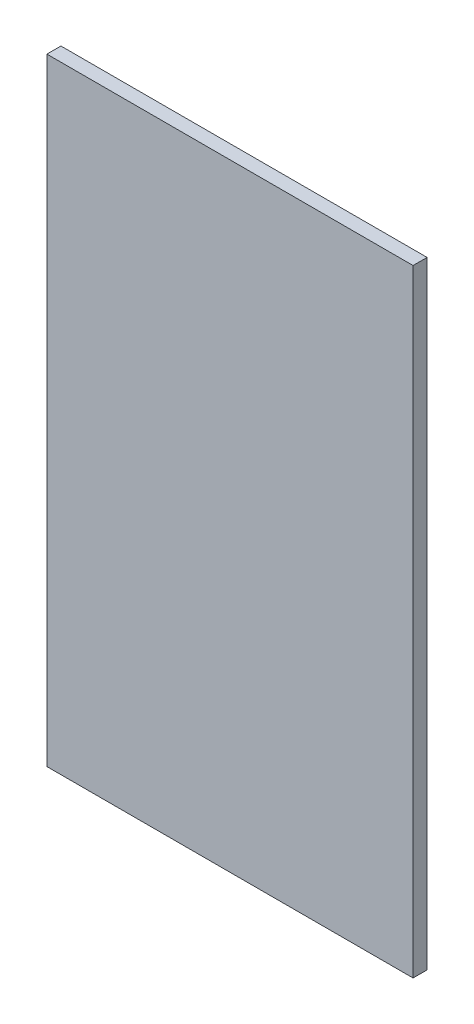
ISO-10303-21;
HEADER;
FILE_DESCRIPTION(('STEP AP214'),'2;1');
FILE_NAME('part.step','',(''),(''),'','','');
FILE_SCHEMA(('AUTOMOTIVE_DESIGN { 1 0 10303 214 1 1 1 1 }'));
ENDSEC;
DATA;
#1=APPLICATION_CONTEXT('core data for automotive mechanical design processes');
#2=APPLICATION_PROTOCOL_DEFINITION('international standard','automotive_design',2000,#1);
#3=PRODUCT_CONTEXT('',#1,'mechanical');
#4=PRODUCT('Part','Part','',(#3));
#5=PRODUCT_RELATED_PRODUCT_CATEGORY('part','',(#4));
#6=PRODUCT_DEFINITION_FORMATION('','',#4);
#7=PRODUCT_DEFINITION_CONTEXT('part definition',#1,'design');
#8=PRODUCT_DEFINITION('design','',#6,#7);
#9=PRODUCT_DEFINITION_SHAPE('','',#8);
#10=(LENGTH_UNIT() NAMED_UNIT(*) SI_UNIT(.MILLI.,.METRE.));
#11=(NAMED_UNIT(*) PLANE_ANGLE_UNIT() SI_UNIT($,.RADIAN.));
#12=(NAMED_UNIT(*) SI_UNIT($,.STERADIAN.) SOLID_ANGLE_UNIT());
#13=UNCERTAINTY_MEASURE_WITH_UNIT(LENGTH_MEASURE(1.E-05),#10,'distance_accuracy_value','');
#14=(GEOMETRIC_REPRESENTATION_CONTEXT(3) GLOBAL_UNCERTAINTY_ASSIGNED_CONTEXT((#13)) GLOBAL_UNIT_ASSIGNED_CONTEXT((#10,
#11,#12)) REPRESENTATION_CONTEXT('',''));
#15=CARTESIAN_POINT('',(0.,0.,0.));
#16=DIRECTION('',(0.,0.,1.));
#17=DIRECTION('',(1.,0.,0.));
#18=AXIS2_PLACEMENT_3D('',#15,#16,#17);
#19=CARTESIAN_POINT('',(0.,0.,18.));
#20=DIRECTION('',(0.,1.,0.));
#21=DIRECTION('',(0.,0.,1.));
#22=AXIS2_PLACEMENT_3D('',#19,#20,#21);
#23=PLANE('',#22);
#24=DIRECTION('',(1.,0.,0.));
#25=VECTOR('',#24,1.);
#26=CARTESIAN_POINT('',(0.,0.,0.));
#27=LINE('',#26,#25);
#28=CARTESIAN_POINT('',(0.,0.,0.));
#29=VERTEX_POINT('',#28);
#30=CARTESIAN_POINT('',(470.,0.,0.));
#31=VERTEX_POINT('',#30);
#32=EDGE_CURVE('E99',#29,#31,#27,.T.);
#33=ORIENTED_EDGE('',*,*,#32,.T.);
#34=DIRECTION('',(0.,0.,-1.));
#35=VECTOR('',#34,1.);
#36=CARTESIAN_POINT('',(470.,0.,18.));
#37=LINE('',#36,#35);
#38=CARTESIAN_POINT('',(470.,0.,18.));
#39=VERTEX_POINT('',#38);
#40=EDGE_CURVE('E11',#39,#31,#37,.T.);
#41=ORIENTED_EDGE('',*,*,#40,.F.);
#42=DIRECTION('',(1.,0.,0.));
#43=VECTOR('',#42,1.);
#44=CARTESIAN_POINT('',(0.,0.,18.));
#45=LINE('',#44,#43);
#46=CARTESIAN_POINT('',(0.,0.,18.));
#47=VERTEX_POINT('',#46);
#48=EDGE_CURVE('E85',#47,#39,#45,.T.);
#49=ORIENTED_EDGE('',*,*,#48,.F.);
#50=DIRECTION('',(0.,0.,-1.));
#51=VECTOR('',#50,1.);
#52=CARTESIAN_POINT('',(0.,0.,18.));
#53=LINE('',#52,#51);
#54=EDGE_CURVE('E52',#47,#29,#53,.T.);
#55=ORIENTED_EDGE('',*,*,#54,.T.);
#56=EDGE_LOOP('',(#33,#41,#49,#55));
#57=FACE_BOUND('',#56,.T.);
#58=ADVANCED_FACE('F36',(#57),#23,.F.);
#59=CARTESIAN_POINT('',(470.,0.,18.));
#60=DIRECTION('',(-1.,0.,0.));
#61=DIRECTION('',(0.,0.,1.));
#62=AXIS2_PLACEMENT_3D('',#59,#60,#61);
#63=PLANE('',#62);
#64=DIRECTION('',(0.,1.,0.));
#65=VECTOR('',#64,1.);
#66=CARTESIAN_POINT('',(470.,0.,0.));
#67=LINE('',#66,#65);
#68=CARTESIAN_POINT('',(470.,792.,0.));
#69=VERTEX_POINT('',#68);
#70=EDGE_CURVE('E90',#31,#69,#67,.T.);
#71=ORIENTED_EDGE('',*,*,#70,.T.);
#72=DIRECTION('',(0.,0.,-1.));
#73=VECTOR('',#72,1.);
#74=CARTESIAN_POINT('',(470.,792.,18.));
#75=LINE('',#74,#73);
#76=CARTESIAN_POINT('',(470.,792.,18.));
#77=VERTEX_POINT('',#76);
#78=EDGE_CURVE('E44',#77,#69,#75,.T.);
#79=ORIENTED_EDGE('',*,*,#78,.F.);
#80=DIRECTION('',(0.,1.,0.));
#81=VECTOR('',#80,1.);
#82=CARTESIAN_POINT('',(470.,0.,18.));
#83=LINE('',#82,#81);
#84=EDGE_CURVE('E77',#39,#77,#83,.T.);
#85=ORIENTED_EDGE('',*,*,#84,.F.);
#86=ORIENTED_EDGE('',*,*,#40,.T.);
#87=EDGE_LOOP('',(#71,#79,#85,#86));
#88=FACE_BOUND('',#87,.T.);
#89=ADVANCED_FACE('F89',(#88),#63,.F.);
#90=CARTESIAN_POINT('',(0.,792.,18.));
#91=DIRECTION('',(0.,1.,0.));
#92=DIRECTION('',(0.,0.,1.));
#93=AXIS2_PLACEMENT_3D('',#90,#91,#92);
#94=PLANE('',#93);
#95=DIRECTION('',(1.,0.,0.));
#96=VECTOR('',#95,1.);
#97=CARTESIAN_POINT('',(0.,792.,0.));
#98=LINE('',#97,#96);
#99=CARTESIAN_POINT('',(0.,792.,0.));
#100=VERTEX_POINT('',#99);
#101=EDGE_CURVE('E102',#100,#69,#98,.T.);
#102=ORIENTED_EDGE('',*,*,#101,.F.);
#103=DIRECTION('',(0.,0.,-1.));
#104=VECTOR('',#103,1.);
#105=CARTESIAN_POINT('',(0.,792.,18.));
#106=LINE('',#105,#104);
#107=CARTESIAN_POINT('',(0.,792.,18.));
#108=VERTEX_POINT('',#107);
#109=EDGE_CURVE('E66',#108,#100,#106,.T.);
#110=ORIENTED_EDGE('',*,*,#109,.F.);
#111=DIRECTION('',(1.,0.,0.));
#112=VECTOR('',#111,1.);
#113=CARTESIAN_POINT('',(0.,792.,18.));
#114=LINE('',#113,#112);
#115=EDGE_CURVE('E84',#108,#77,#114,.T.);
#116=ORIENTED_EDGE('',*,*,#115,.T.);
#117=ORIENTED_EDGE('',*,*,#78,.T.);
#118=EDGE_LOOP('',(#102,#110,#116,#117));
#119=FACE_BOUND('',#118,.T.);
#120=ADVANCED_FACE('F93',(#119),#94,.T.);
#121=CARTESIAN_POINT('',(0.,0.,18.));
#122=DIRECTION('',(-1.,0.,0.));
#123=DIRECTION('',(0.,0.,1.));
#124=AXIS2_PLACEMENT_3D('',#121,#122,#123);
#125=PLANE('',#124);
#126=DIRECTION('',(0.,1.,0.));
#127=VECTOR('',#126,1.);
#128=CARTESIAN_POINT('',(0.,0.,0.));
#129=LINE('',#128,#127);
#130=EDGE_CURVE('E104',#29,#100,#129,.T.);
#131=ORIENTED_EDGE('',*,*,#130,.F.);
#132=ORIENTED_EDGE('',*,*,#54,.F.);
#133=DIRECTION('',(0.,1.,0.));
#134=VECTOR('',#133,1.);
#135=CARTESIAN_POINT('',(0.,0.,18.));
#136=LINE('',#135,#134);
#137=EDGE_CURVE('E94',#47,#108,#136,.T.);
#138=ORIENTED_EDGE('',*,*,#137,.T.);
#139=ORIENTED_EDGE('',*,*,#109,.T.);
#140=EDGE_LOOP('',(#131,#132,#138,#139));
#141=FACE_BOUND('',#140,.T.);
#142=ADVANCED_FACE('F110',(#141),#125,.T.);
#143=CARTESIAN_POINT('',(0.,0.,18.));
#144=DIRECTION('',(0.,0.,1.));
#145=DIRECTION('',(1.,0.,0.));
#146=AXIS2_PLACEMENT_3D('',#143,#144,#145);
#147=PLANE('',#146);
#148=ORIENTED_EDGE('',*,*,#48,.T.);
#149=ORIENTED_EDGE('',*,*,#84,.T.);
#150=ORIENTED_EDGE('',*,*,#115,.F.);
#151=ORIENTED_EDGE('',*,*,#137,.F.);
#152=EDGE_LOOP('',(#148,#149,#150,#151));
#153=FACE_BOUND('',#152,.T.);
#154=ADVANCED_FACE('F81',(#153),#147,.T.);
#155=CARTESIAN_POINT('',(0.,0.,0.));
#156=DIRECTION('',(0.,0.,1.));
#157=DIRECTION('',(1.,0.,0.));
#158=AXIS2_PLACEMENT_3D('',#155,#156,#157);
#159=PLANE('',#158);
#160=ORIENTED_EDGE('',*,*,#32,.F.);
#161=ORIENTED_EDGE('',*,*,#130,.T.);
#162=ORIENTED_EDGE('',*,*,#101,.T.);
#163=ORIENTED_EDGE('',*,*,#70,.F.);
#164=EDGE_LOOP('',(#160,#161,#162,#163));
#165=FACE_BOUND('',#164,.T.);
#166=ADVANCED_FACE('F109',(#165),#159,.F.);
#167=CLOSED_SHELL('',(#58,#89,#120,#142,#154,#166));
#168=MANIFOLD_SOLID_BREP('B2',#167);
#169=ADVANCED_BREP_SHAPE_REPRESENTATION('',(#18,#168),#14);
#170=SHAPE_DEFINITION_REPRESENTATION(#9,#169);
ENDSEC;
END-ISO-10303-21;
